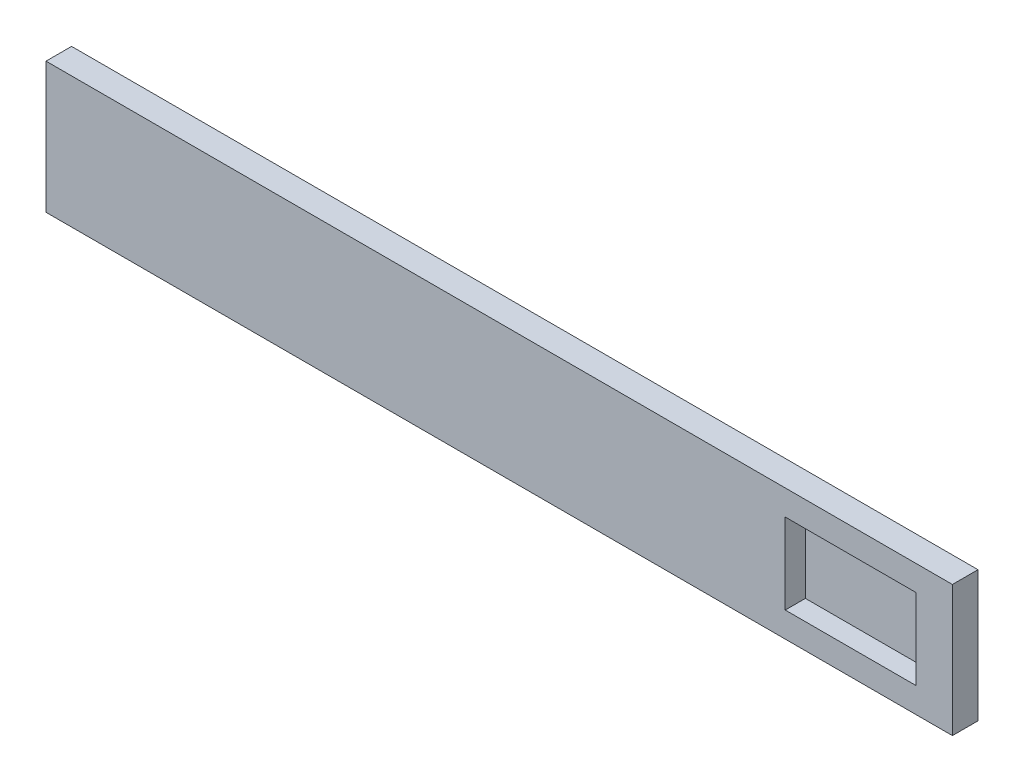
ISO-10303-21;
HEADER;
FILE_DESCRIPTION(('STEP AP214'),'2;1');
FILE_NAME('part.step','',(''),(''),'','','');
FILE_SCHEMA(('AUTOMOTIVE_DESIGN { 1 0 10303 214 1 1 1 1 }'));
ENDSEC;
DATA;
#1=APPLICATION_CONTEXT('core data for automotive mechanical design processes');
#2=APPLICATION_PROTOCOL_DEFINITION('international standard','automotive_design',2000,#1);
#3=PRODUCT_CONTEXT('',#1,'mechanical');
#4=PRODUCT('Part','Part','',(#3));
#5=PRODUCT_RELATED_PRODUCT_CATEGORY('part','',(#4));
#6=PRODUCT_DEFINITION_FORMATION('','',#4);
#7=PRODUCT_DEFINITION_CONTEXT('part definition',#1,'design');
#8=PRODUCT_DEFINITION('design','',#6,#7);
#9=PRODUCT_DEFINITION_SHAPE('','',#8);
#10=(LENGTH_UNIT() NAMED_UNIT(*) SI_UNIT(.MILLI.,.METRE.));
#11=(NAMED_UNIT(*) PLANE_ANGLE_UNIT() SI_UNIT($,.RADIAN.));
#12=(NAMED_UNIT(*) SI_UNIT($,.STERADIAN.) SOLID_ANGLE_UNIT());
#13=UNCERTAINTY_MEASURE_WITH_UNIT(LENGTH_MEASURE(1.E-05),#10,'distance_accuracy_value','');
#14=(GEOMETRIC_REPRESENTATION_CONTEXT(3) GLOBAL_UNCERTAINTY_ASSIGNED_CONTEXT((#13)) GLOBAL_UNIT_ASSIGNED_CONTEXT((#10,
#11,#12)) REPRESENTATION_CONTEXT('',''));
#15=CARTESIAN_POINT('',(0.,0.,0.));
#16=DIRECTION('',(0.,0.,1.));
#17=DIRECTION('',(1.,0.,0.));
#18=AXIS2_PLACEMENT_3D('',#15,#16,#17);
#19=CARTESIAN_POINT('',(0.,0.,25.4));
#20=DIRECTION('',(1.,0.,0.));
#21=DIRECTION('',(0.,0.,-1.));
#22=AXIS2_PLACEMENT_3D('',#19,#20,#21);
#23=PLANE('',#22);
#24=DIRECTION('',(0.,-1.,0.));
#25=VECTOR('',#24,1.);
#26=CARTESIAN_POINT('',(0.,0.,0.));
#27=LINE('',#26,#25);
#28=CARTESIAN_POINT('',(0.,130.,0.));
#29=VERTEX_POINT('',#28);
#30=CARTESIAN_POINT('',(0.,0.,0.));
#31=VERTEX_POINT('',#30);
#32=EDGE_CURVE('E158',#29,#31,#27,.T.);
#33=ORIENTED_EDGE('',*,*,#32,.T.);
#34=DIRECTION('',(0.,0.,-1.));
#35=VECTOR('',#34,1.);
#36=CARTESIAN_POINT('',(0.,0.,25.4));
#37=LINE('',#36,#35);
#38=CARTESIAN_POINT('',(0.,0.,25.4));
#39=VERTEX_POINT('',#38);
#40=EDGE_CURVE('E11',#39,#31,#37,.T.);
#41=ORIENTED_EDGE('',*,*,#40,.F.);
#42=DIRECTION('',(0.,-1.,0.));
#43=VECTOR('',#42,1.);
#44=CARTESIAN_POINT('',(0.,0.,25.4));
#45=LINE('',#44,#43);
#46=CARTESIAN_POINT('',(0.,130.,25.4));
#47=VERTEX_POINT('',#46);
#48=EDGE_CURVE('E164',#47,#39,#45,.T.);
#49=ORIENTED_EDGE('',*,*,#48,.F.);
#50=DIRECTION('',(0.,0.,-1.));
#51=VECTOR('',#50,1.);
#52=CARTESIAN_POINT('',(0.,130.,25.4));
#53=LINE('',#52,#51);
#54=EDGE_CURVE('E174',#47,#29,#53,.T.);
#55=ORIENTED_EDGE('',*,*,#54,.T.);
#56=EDGE_LOOP('',(#33,#41,#49,#55));
#57=FACE_BOUND('',#56,.T.);
#58=ADVANCED_FACE('F39',(#57),#23,.F.);
#59=CARTESIAN_POINT('',(0.,0.,25.4));
#60=DIRECTION('',(0.,1.,0.));
#61=DIRECTION('',(0.,0.,1.));
#62=AXIS2_PLACEMENT_3D('',#59,#60,#61);
#63=PLANE('',#62);
#64=DIRECTION('',(1.,0.,0.));
#65=VECTOR('',#64,1.);
#66=CARTESIAN_POINT('',(0.,0.,0.));
#67=LINE('',#66,#65);
#68=CARTESIAN_POINT('',(900.,0.,0.));
#69=VERTEX_POINT('',#68);
#70=EDGE_CURVE('E178',#31,#69,#67,.T.);
#71=ORIENTED_EDGE('',*,*,#70,.T.);
#72=DIRECTION('',(0.,0.,-1.));
#73=VECTOR('',#72,1.);
#74=CARTESIAN_POINT('',(900.,0.,25.4));
#75=LINE('',#74,#73);
#76=CARTESIAN_POINT('',(900.,0.,25.4));
#77=VERTEX_POINT('',#76);
#78=EDGE_CURVE('E47',#77,#69,#75,.T.);
#79=ORIENTED_EDGE('',*,*,#78,.F.);
#80=DIRECTION('',(1.,0.,0.));
#81=VECTOR('',#80,1.);
#82=CARTESIAN_POINT('',(0.,0.,25.4));
#83=LINE('',#82,#81);
#84=EDGE_CURVE('E91',#39,#77,#83,.T.);
#85=ORIENTED_EDGE('',*,*,#84,.F.);
#86=ORIENTED_EDGE('',*,*,#40,.T.);
#87=EDGE_LOOP('',(#71,#79,#85,#86));
#88=FACE_BOUND('',#87,.T.);
#89=ADVANCED_FACE('F213',(#88),#63,.F.);
#90=CARTESIAN_POINT('',(900.,0.,25.4));
#91=DIRECTION('',(-1.,0.,0.));
#92=DIRECTION('',(0.,0.,1.));
#93=AXIS2_PLACEMENT_3D('',#90,#91,#92);
#94=PLANE('',#93);
#95=DIRECTION('',(0.,1.,0.));
#96=VECTOR('',#95,1.);
#97=CARTESIAN_POINT('',(900.,0.,0.));
#98=LINE('',#97,#96);
#99=CARTESIAN_POINT('',(900.,130.,0.));
#100=VERTEX_POINT('',#99);
#101=EDGE_CURVE('E181',#69,#100,#98,.T.);
#102=ORIENTED_EDGE('',*,*,#101,.T.);
#103=DIRECTION('',(0.,0.,-1.));
#104=VECTOR('',#103,1.);
#105=CARTESIAN_POINT('',(900.,130.,25.4));
#106=LINE('',#105,#104);
#107=CARTESIAN_POINT('',(900.,130.,25.4));
#108=VERTEX_POINT('',#107);
#109=EDGE_CURVE('E188',#108,#100,#106,.T.);
#110=ORIENTED_EDGE('',*,*,#109,.F.);
#111=DIRECTION('',(0.,1.,0.));
#112=VECTOR('',#111,1.);
#113=CARTESIAN_POINT('',(900.,0.,25.4));
#114=LINE('',#113,#112);
#115=EDGE_CURVE('E169',#77,#108,#114,.T.);
#116=ORIENTED_EDGE('',*,*,#115,.F.);
#117=ORIENTED_EDGE('',*,*,#78,.T.);
#118=EDGE_LOOP('',(#102,#110,#116,#117));
#119=FACE_BOUND('',#118,.T.);
#120=ADVANCED_FACE('F195',(#119),#94,.F.);
#121=CARTESIAN_POINT('',(0.,130.,25.4));
#122=DIRECTION('',(0.,-1.,0.));
#123=DIRECTION('',(0.,0.,-1.));
#124=AXIS2_PLACEMENT_3D('',#121,#122,#123);
#125=PLANE('',#124);
#126=DIRECTION('',(-1.,0.,0.));
#127=VECTOR('',#126,1.);
#128=CARTESIAN_POINT('',(0.,130.,0.));
#129=LINE('',#128,#127);
#130=EDGE_CURVE('E84',#100,#29,#129,.T.);
#131=ORIENTED_EDGE('',*,*,#130,.T.);
#132=ORIENTED_EDGE('',*,*,#54,.F.);
#133=DIRECTION('',(-1.,0.,0.));
#134=VECTOR('',#133,1.);
#135=CARTESIAN_POINT('',(0.,130.,25.4));
#136=LINE('',#135,#134);
#137=EDGE_CURVE('E63',#108,#47,#136,.T.);
#138=ORIENTED_EDGE('',*,*,#137,.F.);
#139=ORIENTED_EDGE('',*,*,#109,.T.);
#140=EDGE_LOOP('',(#131,#132,#138,#139));
#141=FACE_BOUND('',#140,.T.);
#142=ADVANCED_FACE('F203',(#141),#125,.F.);
#143=CARTESIAN_POINT('',(0.,0.,25.4));
#144=DIRECTION('',(0.,0.,-1.));
#145=DIRECTION('',(-1.,0.,0.));
#146=AXIS2_PLACEMENT_3D('',#143,#144,#145);
#147=PLANE('',#146);
#148=DIRECTION('',(0.,-1.,0.));
#149=VECTOR('',#148,1.);
#150=CARTESIAN_POINT('',(734.,105.,25.4));
#151=LINE('',#150,#149);
#152=CARTESIAN_POINT('',(734.,105.,25.4));
#153=VERTEX_POINT('',#152);
#154=CARTESIAN_POINT('',(734.,25.0000000000001,25.4));
#155=VERTEX_POINT('',#154);
#156=EDGE_CURVE('E149',#153,#155,#151,.T.);
#157=ORIENTED_EDGE('',*,*,#156,.F.);
#158=DIRECTION('',(-1.,0.,0.));
#159=VECTOR('',#158,1.);
#160=CARTESIAN_POINT('',(864.,105.,25.4));
#161=LINE('',#160,#159);
#162=CARTESIAN_POINT('',(864.,105.,25.4));
#163=VERTEX_POINT('',#162);
#164=EDGE_CURVE('E54',#163,#153,#161,.T.);
#165=ORIENTED_EDGE('',*,*,#164,.F.);
#166=DIRECTION('',(0.,1.,0.));
#167=VECTOR('',#166,1.);
#168=CARTESIAN_POINT('',(864.,105.,25.4));
#169=LINE('',#168,#167);
#170=CARTESIAN_POINT('',(864.,25.,25.4));
#171=VERTEX_POINT('',#170);
#172=EDGE_CURVE('E136',#171,#163,#169,.T.);
#173=ORIENTED_EDGE('',*,*,#172,.F.);
#174=DIRECTION('',(1.,0.,0.));
#175=VECTOR('',#174,1.);
#176=CARTESIAN_POINT('',(864.,25.,25.4));
#177=LINE('',#176,#175);
#178=EDGE_CURVE('E140',#155,#171,#177,.T.);
#179=ORIENTED_EDGE('',*,*,#178,.F.);
#180=EDGE_LOOP('',(#157,#165,#173,#179));
#181=FACE_BOUND('',#180,.T.);
#182=ORIENTED_EDGE('',*,*,#48,.T.);
#183=ORIENTED_EDGE('',*,*,#84,.T.);
#184=ORIENTED_EDGE('',*,*,#115,.T.);
#185=ORIENTED_EDGE('',*,*,#137,.T.);
#186=EDGE_LOOP('',(#182,#183,#184,#185));
#187=FACE_BOUND('',#186,.T.);
#188=ADVANCED_FACE('F205',(#181,#187),#147,.F.);
#189=CARTESIAN_POINT('',(0.,0.,0.));
#190=DIRECTION('',(0.,0.,-1.));
#191=DIRECTION('',(-1.,0.,0.));
#192=AXIS2_PLACEMENT_3D('',#189,#190,#191);
#193=PLANE('',#192);
#194=ORIENTED_EDGE('',*,*,#32,.F.);
#195=ORIENTED_EDGE('',*,*,#130,.F.);
#196=ORIENTED_EDGE('',*,*,#101,.F.);
#197=ORIENTED_EDGE('',*,*,#70,.F.);
#198=EDGE_LOOP('',(#194,#195,#196,#197));
#199=FACE_BOUND('',#198,.T.);
#200=ADVANCED_FACE('F199',(#199),#193,.T.);
#201=CARTESIAN_POINT('',(864.,105.,5.4));
#202=DIRECTION('',(0.,1.,0.));
#203=DIRECTION('',(-1.,0.,0.));
#204=AXIS2_PLACEMENT_3D('',#201,#202,#203);
#205=PLANE('',#204);
#206=ORIENTED_EDGE('',*,*,#164,.T.);
#207=DIRECTION('',(0.,0.,1.));
#208=VECTOR('',#207,1.);
#209=CARTESIAN_POINT('',(734.,105.,5.4));
#210=LINE('',#209,#208);
#211=CARTESIAN_POINT('',(734.,105.,5.4));
#212=VERTEX_POINT('',#211);
#213=EDGE_CURVE('E111',#212,#153,#210,.T.);
#214=ORIENTED_EDGE('',*,*,#213,.F.);
#215=DIRECTION('',(-1.,0.,0.));
#216=VECTOR('',#215,1.);
#217=CARTESIAN_POINT('',(864.,105.,5.4));
#218=LINE('',#217,#216);
#219=CARTESIAN_POINT('',(864.,105.,5.4));
#220=VERTEX_POINT('',#219);
#221=EDGE_CURVE('E115',#220,#212,#218,.T.);
#222=ORIENTED_EDGE('',*,*,#221,.F.);
#223=DIRECTION('',(0.,0.,1.));
#224=VECTOR('',#223,1.);
#225=CARTESIAN_POINT('',(864.,105.,5.4));
#226=LINE('',#225,#224);
#227=EDGE_CURVE('E155',#220,#163,#226,.T.);
#228=ORIENTED_EDGE('',*,*,#227,.T.);
#229=EDGE_LOOP('',(#206,#214,#222,#228));
#230=FACE_BOUND('',#229,.T.);
#231=ADVANCED_FACE('F113',(#230),#205,.F.);
#232=CARTESIAN_POINT('',(864.,105.,5.4));
#233=DIRECTION('',(1.,0.,0.));
#234=DIRECTION('',(0.,0.,-1.));
#235=AXIS2_PLACEMENT_3D('',#232,#233,#234);
#236=PLANE('',#235);
#237=ORIENTED_EDGE('',*,*,#172,.T.);
#238=ORIENTED_EDGE('',*,*,#227,.F.);
#239=DIRECTION('',(0.,1.,0.));
#240=VECTOR('',#239,1.);
#241=CARTESIAN_POINT('',(864.,105.,5.4));
#242=LINE('',#241,#240);
#243=CARTESIAN_POINT('',(864.,25.,5.4));
#244=VERTEX_POINT('',#243);
#245=EDGE_CURVE('E122',#244,#220,#242,.T.);
#246=ORIENTED_EDGE('',*,*,#245,.F.);
#247=DIRECTION('',(0.,0.,1.));
#248=VECTOR('',#247,1.);
#249=CARTESIAN_POINT('',(864.,25.,5.4));
#250=LINE('',#249,#248);
#251=EDGE_CURVE('E159',#244,#171,#250,.T.);
#252=ORIENTED_EDGE('',*,*,#251,.T.);
#253=EDGE_LOOP('',(#237,#238,#246,#252));
#254=FACE_BOUND('',#253,.T.);
#255=ADVANCED_FACE('F252',(#254),#236,.F.);
#256=CARTESIAN_POINT('',(864.,25.,5.4));
#257=DIRECTION('',(0.,-1.,0.));
#258=DIRECTION('',(1.,0.,0.));
#259=AXIS2_PLACEMENT_3D('',#256,#257,#258);
#260=PLANE('',#259);
#261=ORIENTED_EDGE('',*,*,#178,.T.);
#262=ORIENTED_EDGE('',*,*,#251,.F.);
#263=DIRECTION('',(1.,0.,0.));
#264=VECTOR('',#263,1.);
#265=CARTESIAN_POINT('',(864.,25.,5.4));
#266=LINE('',#265,#264);
#267=CARTESIAN_POINT('',(734.,25.0000000000001,5.4));
#268=VERTEX_POINT('',#267);
#269=EDGE_CURVE('E131',#268,#244,#266,.T.);
#270=ORIENTED_EDGE('',*,*,#269,.F.);
#271=DIRECTION('',(0.,0.,1.));
#272=VECTOR('',#271,1.);
#273=CARTESIAN_POINT('',(734.,25.0000000000001,5.4));
#274=LINE('',#273,#272);
#275=EDGE_CURVE('E121',#268,#155,#274,.T.);
#276=ORIENTED_EDGE('',*,*,#275,.T.);
#277=EDGE_LOOP('',(#261,#262,#270,#276));
#278=FACE_BOUND('',#277,.T.);
#279=ADVANCED_FACE('F261',(#278),#260,.F.);
#280=CARTESIAN_POINT('',(734.,105.,5.4));
#281=DIRECTION('',(-1.,0.,0.));
#282=DIRECTION('',(0.,0.,1.));
#283=AXIS2_PLACEMENT_3D('',#280,#281,#282);
#284=PLANE('',#283);
#285=ORIENTED_EDGE('',*,*,#156,.T.);
#286=ORIENTED_EDGE('',*,*,#275,.F.);
#287=DIRECTION('',(0.,-1.,0.));
#288=VECTOR('',#287,1.);
#289=CARTESIAN_POINT('',(734.,105.,5.4));
#290=LINE('',#289,#288);
#291=EDGE_CURVE('E125',#212,#268,#290,.T.);
#292=ORIENTED_EDGE('',*,*,#291,.F.);
#293=ORIENTED_EDGE('',*,*,#213,.T.);
#294=EDGE_LOOP('',(#285,#286,#292,#293));
#295=FACE_BOUND('',#294,.T.);
#296=ADVANCED_FACE('F126',(#295),#284,.F.);
#297=CARTESIAN_POINT('',(0.,0.,5.4));
#298=DIRECTION('',(0.,0.,1.));
#299=DIRECTION('',(1.,0.,0.));
#300=AXIS2_PLACEMENT_3D('',#297,#298,#299);
#301=PLANE('',#300);
#302=ORIENTED_EDGE('',*,*,#221,.T.);
#303=ORIENTED_EDGE('',*,*,#291,.T.);
#304=ORIENTED_EDGE('',*,*,#269,.T.);
#305=ORIENTED_EDGE('',*,*,#245,.T.);
#306=EDGE_LOOP('',(#302,#303,#304,#305));
#307=FACE_BOUND('',#306,.T.);
#308=ADVANCED_FACE('F133',(#307),#301,.T.);
#309=CLOSED_SHELL('',(#58,#89,#120,#142,#188,#200,#231,#255,#279,#296,#308));
#310=MANIFOLD_SOLID_BREP('B2',#309);
#311=ADVANCED_BREP_SHAPE_REPRESENTATION('',(#18,#310),#14);
#312=SHAPE_DEFINITION_REPRESENTATION(#9,#311);
ENDSEC;
END-ISO-10303-21;
